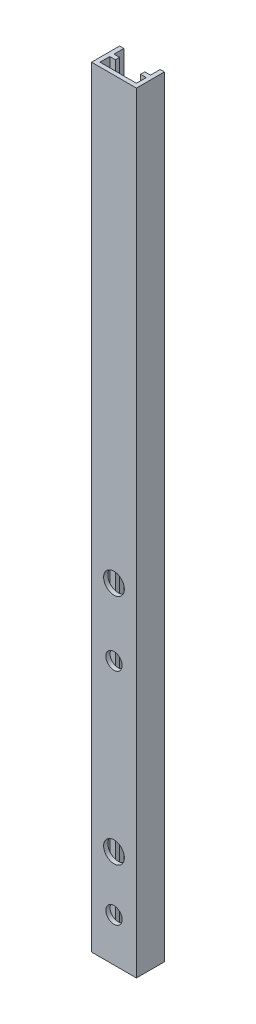
ISO-10303-21;
HEADER;
FILE_DESCRIPTION(('STEP AP214'),'2;1');
FILE_NAME('part.step','',(''),(''),'','','');
FILE_SCHEMA(('AUTOMOTIVE_DESIGN { 1 0 10303 214 1 1 1 1 }'));
ENDSEC;
DATA;
#1=APPLICATION_CONTEXT('core data for automotive mechanical design processes');
#2=APPLICATION_PROTOCOL_DEFINITION('international standard','automotive_design',2000,#1);
#3=PRODUCT_CONTEXT('',#1,'mechanical');
#4=PRODUCT('Part','Part','',(#3));
#5=PRODUCT_RELATED_PRODUCT_CATEGORY('part','',(#4));
#6=PRODUCT_DEFINITION_FORMATION('','',#4);
#7=PRODUCT_DEFINITION_CONTEXT('part definition',#1,'design');
#8=PRODUCT_DEFINITION('design','',#6,#7);
#9=PRODUCT_DEFINITION_SHAPE('','',#8);
#10=(LENGTH_UNIT() NAMED_UNIT(*) SI_UNIT(.MILLI.,.METRE.));
#11=(NAMED_UNIT(*) PLANE_ANGLE_UNIT() SI_UNIT($,.RADIAN.));
#12=(NAMED_UNIT(*) SI_UNIT($,.STERADIAN.) SOLID_ANGLE_UNIT());
#13=UNCERTAINTY_MEASURE_WITH_UNIT(LENGTH_MEASURE(1.E-05),#10,'distance_accuracy_value','');
#14=(GEOMETRIC_REPRESENTATION_CONTEXT(3) GLOBAL_UNCERTAINTY_ASSIGNED_CONTEXT((#13)) GLOBAL_UNIT_ASSIGNED_CONTEXT((#10,
#11,#12)) REPRESENTATION_CONTEXT('',''));
#15=CARTESIAN_POINT('',(0.,0.,0.));
#16=DIRECTION('',(0.,0.,1.));
#17=DIRECTION('',(1.,0.,0.));
#18=AXIS2_PLACEMENT_3D('',#15,#16,#17);
#19=CARTESIAN_POINT('',(16.,275.,0.));
#20=DIRECTION('',(0.,0.,1.));
#21=DIRECTION('',(1.,0.,0.));
#22=AXIS2_PLACEMENT_3D('',#19,#20,#21);
#23=PLANE('',#22);
#24=DIRECTION('',(-1.,0.,0.));
#25=VECTOR('',#24,1.);
#26=CARTESIAN_POINT('',(16.,0.,0.));
#27=LINE('',#26,#25);
#28=CARTESIAN_POINT('',(16.,0.,0.));
#29=VERTEX_POINT('',#28);
#30=CARTESIAN_POINT('',(14.5,0.,0.));
#31=VERTEX_POINT('',#30);
#32=EDGE_CURVE('E182',#29,#31,#27,.T.);
#33=ORIENTED_EDGE('',*,*,#32,.T.);
#34=DIRECTION('',(0.,1.,0.));
#35=VECTOR('',#34,1.);
#36=CARTESIAN_POINT('',(14.5,0.,0.));
#37=LINE('',#36,#35);
#38=CARTESIAN_POINT('',(14.5,275.,0.));
#39=VERTEX_POINT('',#38);
#40=EDGE_CURVE('E183',#31,#39,#37,.T.);
#41=ORIENTED_EDGE('',*,*,#40,.T.);
#42=DIRECTION('',(-1.,0.,0.));
#43=VECTOR('',#42,1.);
#44=CARTESIAN_POINT('',(16.,275.,0.));
#45=LINE('',#44,#43);
#46=CARTESIAN_POINT('',(16.,275.,0.));
#47=VERTEX_POINT('',#46);
#48=EDGE_CURVE('E267',#47,#39,#45,.T.);
#49=ORIENTED_EDGE('',*,*,#48,.F.);
#50=DIRECTION('',(0.,-1.,0.));
#51=VECTOR('',#50,1.);
#52=CARTESIAN_POINT('',(16.,275.,0.));
#53=LINE('',#52,#51);
#54=EDGE_CURVE('E196',#47,#29,#53,.T.);
#55=ORIENTED_EDGE('',*,*,#54,.T.);
#56=EDGE_LOOP('',(#33,#41,#49,#55));
#57=FACE_BOUND('',#56,.T.);
#58=ADVANCED_FACE('F38',(#57),#23,.F.);
#59=CARTESIAN_POINT('',(1.5,275.,0.));
#60=VERTEX_POINT('',#59);
#61=CARTESIAN_POINT('',(0.,275.,0.));
#62=VERTEX_POINT('',#61);
#63=EDGE_CURVE('E92',#60,#62,#45,.T.);
#64=ORIENTED_EDGE('',*,*,#63,.F.);
#65=DIRECTION('',(0.,1.,0.));
#66=VECTOR('',#65,1.);
#67=CARTESIAN_POINT('',(1.5,0.,0.));
#68=LINE('',#67,#66);
#69=CARTESIAN_POINT('',(1.5,0.,0.));
#70=VERTEX_POINT('',#69);
#71=EDGE_CURVE('E166',#70,#60,#68,.T.);
#72=ORIENTED_EDGE('',*,*,#71,.F.);
#73=CARTESIAN_POINT('',(0.,0.,0.));
#74=VERTEX_POINT('',#73);
#75=EDGE_CURVE('E174',#70,#74,#27,.T.);
#76=ORIENTED_EDGE('',*,*,#75,.T.);
#77=DIRECTION('',(0.,-1.,0.));
#78=VECTOR('',#77,1.);
#79=CARTESIAN_POINT('',(0.,275.,0.));
#80=LINE('',#79,#78);
#81=EDGE_CURVE('E11',#62,#74,#80,.T.);
#82=ORIENTED_EDGE('',*,*,#81,.F.);
#83=EDGE_LOOP('',(#64,#72,#76,#82));
#84=FACE_BOUND('',#83,.T.);
#85=ADVANCED_FACE('F40',(#84),#23,.F.);
#86=CARTESIAN_POINT('',(0.,275.,0.));
#87=DIRECTION('',(1.,0.,0.));
#88=DIRECTION('',(0.,0.,-1.));
#89=AXIS2_PLACEMENT_3D('',#86,#87,#88);
#90=PLANE('',#89);
#91=DIRECTION('',(0.,0.,1.));
#92=VECTOR('',#91,1.);
#93=CARTESIAN_POINT('',(0.,0.,0.));
#94=LINE('',#93,#92);
#95=CARTESIAN_POINT('',(0.,0.,10.));
#96=VERTEX_POINT('',#95);
#97=EDGE_CURVE('E181',#74,#96,#94,.T.);
#98=ORIENTED_EDGE('',*,*,#97,.T.);
#99=DIRECTION('',(0.,-1.,0.));
#100=VECTOR('',#99,1.);
#101=CARTESIAN_POINT('',(0.,275.,10.));
#102=LINE('',#101,#100);
#103=CARTESIAN_POINT('',(0.,275.,10.));
#104=VERTEX_POINT('',#103);
#105=EDGE_CURVE('E47',#104,#96,#102,.T.);
#106=ORIENTED_EDGE('',*,*,#105,.F.);
#107=DIRECTION('',(0.,0.,1.));
#108=VECTOR('',#107,1.);
#109=CARTESIAN_POINT('',(0.,275.,0.));
#110=LINE('',#109,#108);
#111=EDGE_CURVE('E269',#62,#104,#110,.T.);
#112=ORIENTED_EDGE('',*,*,#111,.F.);
#113=ORIENTED_EDGE('',*,*,#81,.T.);
#114=EDGE_LOOP('',(#98,#106,#112,#113));
#115=FACE_BOUND('',#114,.T.);
#116=ADVANCED_FACE('F360',(#115),#90,.F.);
#117=CARTESIAN_POINT('',(0.,275.,10.));
#118=DIRECTION('',(0.,0.,-1.));
#119=DIRECTION('',(-1.,0.,0.));
#120=AXIS2_PLACEMENT_3D('',#117,#118,#119);
#121=PLANE('',#120);
#122=CARTESIAN_POINT('',(8.,15.5,10.));
#123=DIRECTION('',(0.,0.,1.));
#124=DIRECTION('',(1.,0.,0.));
#125=AXIS2_PLACEMENT_3D('',#122,#123,#124);
#126=CIRCLE('',#125,2.9);
#127=CARTESIAN_POINT('',(10.9,15.5,10.));
#128=VERTEX_POINT('',#127);
#129=EDGE_CURVE('E206',#128,#128,#126,.T.);
#130=ORIENTED_EDGE('',*,*,#129,.F.);
#131=EDGE_LOOP('',(#130));
#132=FACE_BOUND('',#131,.T.);
#133=CARTESIAN_POINT('',(8.,35.,10.));
#134=DIRECTION('',(0.,0.,1.));
#135=DIRECTION('',(1.,0.,0.));
#136=AXIS2_PLACEMENT_3D('',#133,#134,#135);
#137=CIRCLE('',#136,3.7);
#138=CARTESIAN_POINT('',(11.7,35.,10.));
#139=VERTEX_POINT('',#138);
#140=EDGE_CURVE('E349',#139,#139,#137,.T.);
#141=ORIENTED_EDGE('',*,*,#140,.F.);
#142=EDGE_LOOP('',(#141));
#143=FACE_BOUND('',#142,.T.);
#144=CARTESIAN_POINT('',(8.,94.,10.));
#145=DIRECTION('',(0.,0.,1.));
#146=DIRECTION('',(1.,0.,0.));
#147=AXIS2_PLACEMENT_3D('',#144,#145,#146);
#148=CIRCLE('',#147,2.9);
#149=CARTESIAN_POINT('',(10.9,94.,10.));
#150=VERTEX_POINT('',#149);
#151=EDGE_CURVE('E346',#150,#150,#148,.T.);
#152=ORIENTED_EDGE('',*,*,#151,.F.);
#153=EDGE_LOOP('',(#152));
#154=FACE_BOUND('',#153,.T.);
#155=CARTESIAN_POINT('',(8.,118.,10.));
#156=DIRECTION('',(0.,0.,1.));
#157=DIRECTION('',(1.,0.,0.));
#158=AXIS2_PLACEMENT_3D('',#155,#156,#157);
#159=CIRCLE('',#158,3.7);
#160=CARTESIAN_POINT('',(11.7,118.,10.));
#161=VERTEX_POINT('',#160);
#162=EDGE_CURVE('E343',#161,#161,#159,.T.);
#163=ORIENTED_EDGE('',*,*,#162,.F.);
#164=EDGE_LOOP('',(#163));
#165=FACE_BOUND('',#164,.T.);
#166=DIRECTION('',(1.,0.,0.));
#167=VECTOR('',#166,1.);
#168=CARTESIAN_POINT('',(0.,0.,10.));
#169=LINE('',#168,#167);
#170=CARTESIAN_POINT('',(16.,0.,9.99999999999999));
#171=VERTEX_POINT('',#170);
#172=EDGE_CURVE('E193',#96,#171,#169,.T.);
#173=ORIENTED_EDGE('',*,*,#172,.T.);
#174=DIRECTION('',(0.,-1.,0.));
#175=VECTOR('',#174,1.);
#176=CARTESIAN_POINT('',(16.,275.,9.99999999999999));
#177=LINE('',#176,#175);
#178=CARTESIAN_POINT('',(16.,275.,9.99999999999999));
#179=VERTEX_POINT('',#178);
#180=EDGE_CURVE('E198',#179,#171,#177,.T.);
#181=ORIENTED_EDGE('',*,*,#180,.F.);
#182=DIRECTION('',(1.,0.,0.));
#183=VECTOR('',#182,1.);
#184=CARTESIAN_POINT('',(0.,275.,10.));
#185=LINE('',#184,#183);
#186=EDGE_CURVE('E270',#104,#179,#185,.T.);
#187=ORIENTED_EDGE('',*,*,#186,.F.);
#188=ORIENTED_EDGE('',*,*,#105,.T.);
#189=EDGE_LOOP('',(#173,#181,#187,#188));
#190=FACE_BOUND('',#189,.T.);
#191=ADVANCED_FACE('F277',(#132,#143,#154,#165,#190),#121,.F.);
#192=CARTESIAN_POINT('',(16.,275.,9.99999999999999));
#193=DIRECTION('',(-1.,0.,0.));
#194=DIRECTION('',(0.,0.,1.));
#195=AXIS2_PLACEMENT_3D('',#192,#193,#194);
#196=PLANE('',#195);
#197=DIRECTION('',(0.,0.,-1.));
#198=VECTOR('',#197,1.);
#199=CARTESIAN_POINT('',(16.,0.,9.99999999999999));
#200=LINE('',#199,#198);
#201=EDGE_CURVE('E85',#171,#29,#200,.T.);
#202=ORIENTED_EDGE('',*,*,#201,.T.);
#203=ORIENTED_EDGE('',*,*,#54,.F.);
#204=DIRECTION('',(0.,0.,-1.));
#205=VECTOR('',#204,1.);
#206=CARTESIAN_POINT('',(16.,275.,9.99999999999999));
#207=LINE('',#206,#205);
#208=EDGE_CURVE('E64',#179,#47,#207,.T.);
#209=ORIENTED_EDGE('',*,*,#208,.F.);
#210=ORIENTED_EDGE('',*,*,#180,.T.);
#211=EDGE_LOOP('',(#202,#203,#209,#210));
#212=FACE_BOUND('',#211,.T.);
#213=ADVANCED_FACE('F278',(#212),#196,.F.);
#214=CARTESIAN_POINT('',(0.,275.,0.));
#215=DIRECTION('',(0.,1.,0.));
#216=DIRECTION('',(0.,0.,1.));
#217=AXIS2_PLACEMENT_3D('',#214,#215,#216);
#218=PLANE('',#217);
#219=DIRECTION('',(0.,0.,-1.));
#220=VECTOR('',#219,1.);
#221=CARTESIAN_POINT('',(14.5,275.,3.5));
#222=LINE('',#221,#220);
#223=CARTESIAN_POINT('',(14.5,275.,3.5));
#224=VERTEX_POINT('',#223);
#225=EDGE_CURVE('E170',#224,#39,#222,.T.);
#226=ORIENTED_EDGE('',*,*,#225,.F.);
#227=DIRECTION('',(1.,0.,0.));
#228=VECTOR('',#227,1.);
#229=CARTESIAN_POINT('',(12.5,275.,3.5));
#230=LINE('',#229,#228);
#231=CARTESIAN_POINT('',(12.5,275.,3.5));
#232=VERTEX_POINT('',#231);
#233=EDGE_CURVE('E245',#232,#224,#230,.T.);
#234=ORIENTED_EDGE('',*,*,#233,.F.);
#235=DIRECTION('',(0.,0.,-1.));
#236=VECTOR('',#235,1.);
#237=CARTESIAN_POINT('',(12.5,275.,5.));
#238=LINE('',#237,#236);
#239=CARTESIAN_POINT('',(12.5,275.,5.));
#240=VERTEX_POINT('',#239);
#241=EDGE_CURVE('E242',#240,#232,#238,.T.);
#242=ORIENTED_EDGE('',*,*,#241,.F.);
#243=DIRECTION('',(-1.,0.,0.));
#244=VECTOR('',#243,1.);
#245=CARTESIAN_POINT('',(14.5,275.,5.));
#246=LINE('',#245,#244);
#247=CARTESIAN_POINT('',(14.5,275.,5.));
#248=VERTEX_POINT('',#247);
#249=EDGE_CURVE('E239',#248,#240,#246,.T.);
#250=ORIENTED_EDGE('',*,*,#249,.F.);
#251=DIRECTION('',(0.,0.,-1.));
#252=VECTOR('',#251,1.);
#253=CARTESIAN_POINT('',(14.5,275.,8.5));
#254=LINE('',#253,#252);
#255=CARTESIAN_POINT('',(14.5,275.,8.5));
#256=VERTEX_POINT('',#255);
#257=EDGE_CURVE('E236',#256,#248,#254,.T.);
#258=ORIENTED_EDGE('',*,*,#257,.F.);
#259=DIRECTION('',(1.,0.,0.));
#260=VECTOR('',#259,1.);
#261=CARTESIAN_POINT('',(1.5,275.,8.5));
#262=LINE('',#261,#260);
#263=CARTESIAN_POINT('',(1.5,275.,8.5));
#264=VERTEX_POINT('',#263);
#265=EDGE_CURVE('E233',#264,#256,#262,.T.);
#266=ORIENTED_EDGE('',*,*,#265,.F.);
#267=DIRECTION('',(0.,0.,1.));
#268=VECTOR('',#267,1.);
#269=CARTESIAN_POINT('',(1.5,275.,5.));
#270=LINE('',#269,#268);
#271=CARTESIAN_POINT('',(1.5,275.,5.));
#272=VERTEX_POINT('',#271);
#273=EDGE_CURVE('E230',#272,#264,#270,.T.);
#274=ORIENTED_EDGE('',*,*,#273,.F.);
#275=DIRECTION('',(-1.,0.,0.));
#276=VECTOR('',#275,1.);
#277=CARTESIAN_POINT('',(3.5,275.,5.));
#278=LINE('',#277,#276);
#279=CARTESIAN_POINT('',(3.5,275.,5.));
#280=VERTEX_POINT('',#279);
#281=EDGE_CURVE('E227',#280,#272,#278,.T.);
#282=ORIENTED_EDGE('',*,*,#281,.F.);
#283=DIRECTION('',(0.,0.,1.));
#284=VECTOR('',#283,1.);
#285=CARTESIAN_POINT('',(3.5,275.,3.5));
#286=LINE('',#285,#284);
#287=CARTESIAN_POINT('',(3.5,275.,3.5));
#288=VERTEX_POINT('',#287);
#289=EDGE_CURVE('E220',#288,#280,#286,.T.);
#290=ORIENTED_EDGE('',*,*,#289,.F.);
#291=DIRECTION('',(1.,0.,0.));
#292=VECTOR('',#291,1.);
#293=CARTESIAN_POINT('',(1.5,275.,3.5));
#294=LINE('',#293,#292);
#295=CARTESIAN_POINT('',(1.5,275.,3.5));
#296=VERTEX_POINT('',#295);
#297=EDGE_CURVE('E216',#296,#288,#294,.T.);
#298=ORIENTED_EDGE('',*,*,#297,.F.);
#299=DIRECTION('',(0.,0.,1.));
#300=VECTOR('',#299,1.);
#301=CARTESIAN_POINT('',(1.5,275.,0.));
#302=LINE('',#301,#300);
#303=EDGE_CURVE('E213',#60,#296,#302,.T.);
#304=ORIENTED_EDGE('',*,*,#303,.F.);
#305=ORIENTED_EDGE('',*,*,#63,.T.);
#306=ORIENTED_EDGE('',*,*,#111,.T.);
#307=ORIENTED_EDGE('',*,*,#186,.T.);
#308=ORIENTED_EDGE('',*,*,#208,.T.);
#309=ORIENTED_EDGE('',*,*,#48,.T.);
#310=EDGE_LOOP('',(#226,#234,#242,#250,#258,#266,#274,#282,#290,#298,#304,#305,#306,#307,#308,#309));
#311=FACE_BOUND('',#310,.T.);
#312=ADVANCED_FACE('F274',(#311),#218,.T.);
#313=CARTESIAN_POINT('',(0.,0.,0.));
#314=DIRECTION('',(0.,1.,0.));
#315=DIRECTION('',(0.,0.,1.));
#316=AXIS2_PLACEMENT_3D('',#313,#314,#315);
#317=PLANE('',#316);
#318=DIRECTION('',(1.,0.,0.));
#319=VECTOR('',#318,1.);
#320=CARTESIAN_POINT('',(12.5,0.,3.5));
#321=LINE('',#320,#319);
#322=CARTESIAN_POINT('',(12.5,0.,3.5));
#323=VERTEX_POINT('',#322);
#324=CARTESIAN_POINT('',(14.5,0.,3.5));
#325=VERTEX_POINT('',#324);
#326=EDGE_CURVE('E291',#323,#325,#321,.T.);
#327=ORIENTED_EDGE('',*,*,#326,.T.);
#328=DIRECTION('',(0.,0.,-1.));
#329=VECTOR('',#328,1.);
#330=CARTESIAN_POINT('',(14.5,0.,3.5));
#331=LINE('',#330,#329);
#332=EDGE_CURVE('E176',#325,#31,#331,.T.);
#333=ORIENTED_EDGE('',*,*,#332,.T.);
#334=ORIENTED_EDGE('',*,*,#32,.F.);
#335=ORIENTED_EDGE('',*,*,#201,.F.);
#336=ORIENTED_EDGE('',*,*,#172,.F.);
#337=ORIENTED_EDGE('',*,*,#97,.F.);
#338=ORIENTED_EDGE('',*,*,#75,.F.);
#339=DIRECTION('',(0.,0.,1.));
#340=VECTOR('',#339,1.);
#341=CARTESIAN_POINT('',(1.5,0.,0.));
#342=LINE('',#341,#340);
#343=CARTESIAN_POINT('',(1.5,0.,3.5));
#344=VERTEX_POINT('',#343);
#345=EDGE_CURVE('E162',#70,#344,#342,.T.);
#346=ORIENTED_EDGE('',*,*,#345,.T.);
#347=DIRECTION('',(1.,0.,0.));
#348=VECTOR('',#347,1.);
#349=CARTESIAN_POINT('',(1.5,0.,3.5));
#350=LINE('',#349,#348);
#351=CARTESIAN_POINT('',(3.5,0.,3.5));
#352=VERTEX_POINT('',#351);
#353=EDGE_CURVE('E55',#344,#352,#350,.T.);
#354=ORIENTED_EDGE('',*,*,#353,.T.);
#355=DIRECTION('',(0.,0.,1.));
#356=VECTOR('',#355,1.);
#357=CARTESIAN_POINT('',(3.5,0.,3.5));
#358=LINE('',#357,#356);
#359=CARTESIAN_POINT('',(3.5,0.,5.));
#360=VERTEX_POINT('',#359);
#361=EDGE_CURVE('E331',#352,#360,#358,.T.);
#362=ORIENTED_EDGE('',*,*,#361,.T.);
#363=DIRECTION('',(-1.,0.,0.));
#364=VECTOR('',#363,1.);
#365=CARTESIAN_POINT('',(3.5,0.,5.));
#366=LINE('',#365,#364);
#367=CARTESIAN_POINT('',(1.5,0.,5.));
#368=VERTEX_POINT('',#367);
#369=EDGE_CURVE('E325',#360,#368,#366,.T.);
#370=ORIENTED_EDGE('',*,*,#369,.T.);
#371=DIRECTION('',(0.,0.,1.));
#372=VECTOR('',#371,1.);
#373=CARTESIAN_POINT('',(1.5,0.,5.));
#374=LINE('',#373,#372);
#375=CARTESIAN_POINT('',(1.5,0.,8.5));
#376=VERTEX_POINT('',#375);
#377=EDGE_CURVE('E320',#368,#376,#374,.T.);
#378=ORIENTED_EDGE('',*,*,#377,.T.);
#379=DIRECTION('',(1.,0.,0.));
#380=VECTOR('',#379,1.);
#381=CARTESIAN_POINT('',(1.5,0.,8.5));
#382=LINE('',#381,#380);
#383=CARTESIAN_POINT('',(14.5,0.,8.5));
#384=VERTEX_POINT('',#383);
#385=EDGE_CURVE('E338',#376,#384,#382,.T.);
#386=ORIENTED_EDGE('',*,*,#385,.T.);
#387=DIRECTION('',(0.,0.,-1.));
#388=VECTOR('',#387,1.);
#389=CARTESIAN_POINT('',(14.5,0.,8.5));
#390=LINE('',#389,#388);
#391=CARTESIAN_POINT('',(14.5,0.,5.));
#392=VERTEX_POINT('',#391);
#393=EDGE_CURVE('E308',#384,#392,#390,.T.);
#394=ORIENTED_EDGE('',*,*,#393,.T.);
#395=DIRECTION('',(-1.,0.,0.));
#396=VECTOR('',#395,1.);
#397=CARTESIAN_POINT('',(14.5,0.,5.));
#398=LINE('',#397,#396);
#399=CARTESIAN_POINT('',(12.5,0.,5.));
#400=VERTEX_POINT('',#399);
#401=EDGE_CURVE('E303',#392,#400,#398,.T.);
#402=ORIENTED_EDGE('',*,*,#401,.T.);
#403=DIRECTION('',(0.,0.,-1.));
#404=VECTOR('',#403,1.);
#405=CARTESIAN_POINT('',(12.5,0.,5.));
#406=LINE('',#405,#404);
#407=EDGE_CURVE('E342',#400,#323,#406,.T.);
#408=ORIENTED_EDGE('',*,*,#407,.T.);
#409=EDGE_LOOP('',(#327,#333,#334,#335,#336,#337,#338,#346,#354,#362,#370,#378,#386,#394,#402,#408));
#410=FACE_BOUND('',#409,.T.);
#411=ADVANCED_FACE('F179',(#410),#317,.F.);
#412=CARTESIAN_POINT('',(14.5,0.,3.5));
#413=DIRECTION('',(1.,0.,0.));
#414=DIRECTION('',(0.,0.,-1.));
#415=AXIS2_PLACEMENT_3D('',#412,#413,#414);
#416=PLANE('',#415);
#417=ORIENTED_EDGE('',*,*,#225,.T.);
#418=ORIENTED_EDGE('',*,*,#40,.F.);
#419=ORIENTED_EDGE('',*,*,#332,.F.);
#420=DIRECTION('',(0.,1.,0.));
#421=VECTOR('',#420,1.);
#422=CARTESIAN_POINT('',(14.5,0.,3.5));
#423=LINE('',#422,#421);
#424=EDGE_CURVE('E187',#325,#224,#423,.T.);
#425=ORIENTED_EDGE('',*,*,#424,.T.);
#426=EDGE_LOOP('',(#417,#418,#419,#425));
#427=FACE_BOUND('',#426,.T.);
#428=ADVANCED_FACE('F285',(#427),#416,.F.);
#429=CARTESIAN_POINT('',(12.5,0.,3.5));
#430=DIRECTION('',(0.,0.,1.));
#431=DIRECTION('',(1.,0.,0.));
#432=AXIS2_PLACEMENT_3D('',#429,#430,#431);
#433=PLANE('',#432);
#434=ORIENTED_EDGE('',*,*,#233,.T.);
#435=ORIENTED_EDGE('',*,*,#424,.F.);
#436=ORIENTED_EDGE('',*,*,#326,.F.);
#437=DIRECTION('',(0.,1.,0.));
#438=VECTOR('',#437,1.);
#439=CARTESIAN_POINT('',(12.5,0.,3.5));
#440=LINE('',#439,#438);
#441=EDGE_CURVE('E250',#323,#232,#440,.T.);
#442=ORIENTED_EDGE('',*,*,#441,.T.);
#443=EDGE_LOOP('',(#434,#435,#436,#442));
#444=FACE_BOUND('',#443,.T.);
#445=ADVANCED_FACE('F290',(#444),#433,.F.);
#446=CARTESIAN_POINT('',(12.5,0.,5.));
#447=DIRECTION('',(1.,0.,0.));
#448=DIRECTION('',(0.,0.,-1.));
#449=AXIS2_PLACEMENT_3D('',#446,#447,#448);
#450=PLANE('',#449);
#451=ORIENTED_EDGE('',*,*,#241,.T.);
#452=ORIENTED_EDGE('',*,*,#441,.F.);
#453=ORIENTED_EDGE('',*,*,#407,.F.);
#454=DIRECTION('',(0.,1.,0.));
#455=VECTOR('',#454,1.);
#456=CARTESIAN_POINT('',(12.5,0.,5.));
#457=LINE('',#456,#455);
#458=EDGE_CURVE('E252',#400,#240,#457,.T.);
#459=ORIENTED_EDGE('',*,*,#458,.T.);
#460=EDGE_LOOP('',(#451,#452,#453,#459));
#461=FACE_BOUND('',#460,.T.);
#462=ADVANCED_FACE('F295',(#461),#450,.F.);
#463=CARTESIAN_POINT('',(14.5,0.,5.));
#464=DIRECTION('',(0.,0.,-1.));
#465=DIRECTION('',(-1.,0.,0.));
#466=AXIS2_PLACEMENT_3D('',#463,#464,#465);
#467=PLANE('',#466);
#468=ORIENTED_EDGE('',*,*,#249,.T.);
#469=ORIENTED_EDGE('',*,*,#458,.F.);
#470=ORIENTED_EDGE('',*,*,#401,.F.);
#471=DIRECTION('',(0.,1.,0.));
#472=VECTOR('',#471,1.);
#473=CARTESIAN_POINT('',(14.5,0.,5.));
#474=LINE('',#473,#472);
#475=EDGE_CURVE('E254',#392,#248,#474,.T.);
#476=ORIENTED_EDGE('',*,*,#475,.T.);
#477=EDGE_LOOP('',(#468,#469,#470,#476));
#478=FACE_BOUND('',#477,.T.);
#479=ADVANCED_FACE('F300',(#478),#467,.F.);
#480=CARTESIAN_POINT('',(14.5,0.,8.5));
#481=DIRECTION('',(1.,0.,0.));
#482=DIRECTION('',(0.,0.,-1.));
#483=AXIS2_PLACEMENT_3D('',#480,#481,#482);
#484=PLANE('',#483);
#485=ORIENTED_EDGE('',*,*,#257,.T.);
#486=ORIENTED_EDGE('',*,*,#475,.F.);
#487=ORIENTED_EDGE('',*,*,#393,.F.);
#488=DIRECTION('',(0.,1.,0.));
#489=VECTOR('',#488,1.);
#490=CARTESIAN_POINT('',(14.5,0.,8.5));
#491=LINE('',#490,#489);
#492=EDGE_CURVE('E256',#384,#256,#491,.T.);
#493=ORIENTED_EDGE('',*,*,#492,.T.);
#494=EDGE_LOOP('',(#485,#486,#487,#493));
#495=FACE_BOUND('',#494,.T.);
#496=ADVANCED_FACE('F307',(#495),#484,.F.);
#497=CARTESIAN_POINT('',(1.5,0.,8.5));
#498=DIRECTION('',(0.,0.,1.));
#499=DIRECTION('',(1.,0.,0.));
#500=AXIS2_PLACEMENT_3D('',#497,#498,#499);
#501=PLANE('',#500);
#502=CARTESIAN_POINT('',(8.,15.5,8.5));
#503=DIRECTION('',(0.,0.,1.));
#504=DIRECTION('',(1.,0.,0.));
#505=AXIS2_PLACEMENT_3D('',#502,#503,#504);
#506=CIRCLE('',#505,2.9);
#507=CARTESIAN_POINT('',(10.9,15.5,8.5));
#508=VERTEX_POINT('',#507);
#509=EDGE_CURVE('E42',#508,#508,#506,.T.);
#510=ORIENTED_EDGE('',*,*,#509,.T.);
#511=EDGE_LOOP('',(#510));
#512=FACE_BOUND('',#511,.T.);
#513=CARTESIAN_POINT('',(8.,35.,8.5));
#514=DIRECTION('',(0.,0.,1.));
#515=DIRECTION('',(1.,0.,0.));
#516=AXIS2_PLACEMENT_3D('',#513,#514,#515);
#517=CIRCLE('',#516,3.7);
#518=CARTESIAN_POINT('',(11.7,35.,8.5));
#519=VERTEX_POINT('',#518);
#520=EDGE_CURVE('E208',#519,#519,#517,.T.);
#521=ORIENTED_EDGE('',*,*,#520,.T.);
#522=EDGE_LOOP('',(#521));
#523=FACE_BOUND('',#522,.T.);
#524=CARTESIAN_POINT('',(8.,94.,8.5));
#525=DIRECTION('',(0.,0.,1.));
#526=DIRECTION('',(1.,0.,0.));
#527=AXIS2_PLACEMENT_3D('',#524,#525,#526);
#528=CIRCLE('',#527,2.9);
#529=CARTESIAN_POINT('',(10.9,94.,8.5));
#530=VERTEX_POINT('',#529);
#531=EDGE_CURVE('E205',#530,#530,#528,.T.);
#532=ORIENTED_EDGE('',*,*,#531,.T.);
#533=EDGE_LOOP('',(#532));
#534=FACE_BOUND('',#533,.T.);
#535=CARTESIAN_POINT('',(8.,118.,8.5));
#536=DIRECTION('',(0.,0.,1.));
#537=DIRECTION('',(1.,0.,0.));
#538=AXIS2_PLACEMENT_3D('',#535,#536,#537);
#539=CIRCLE('',#538,3.7);
#540=CARTESIAN_POINT('',(11.7,118.,8.5));
#541=VERTEX_POINT('',#540);
#542=EDGE_CURVE('E202',#541,#541,#539,.T.);
#543=ORIENTED_EDGE('',*,*,#542,.T.);
#544=EDGE_LOOP('',(#543));
#545=FACE_BOUND('',#544,.T.);
#546=ORIENTED_EDGE('',*,*,#265,.T.);
#547=ORIENTED_EDGE('',*,*,#492,.F.);
#548=ORIENTED_EDGE('',*,*,#385,.F.);
#549=DIRECTION('',(0.,1.,0.));
#550=VECTOR('',#549,1.);
#551=CARTESIAN_POINT('',(1.5,0.,8.5));
#552=LINE('',#551,#550);
#553=EDGE_CURVE('E258',#376,#264,#552,.T.);
#554=ORIENTED_EDGE('',*,*,#553,.T.);
#555=EDGE_LOOP('',(#546,#547,#548,#554));
#556=FACE_BOUND('',#555,.T.);
#557=ADVANCED_FACE('F312',(#512,#523,#534,#545,#556),#501,.F.);
#558=CARTESIAN_POINT('',(1.5,0.,5.));
#559=DIRECTION('',(-1.,0.,0.));
#560=DIRECTION('',(0.,0.,1.));
#561=AXIS2_PLACEMENT_3D('',#558,#559,#560);
#562=PLANE('',#561);
#563=ORIENTED_EDGE('',*,*,#273,.T.);
#564=ORIENTED_EDGE('',*,*,#553,.F.);
#565=ORIENTED_EDGE('',*,*,#377,.F.);
#566=DIRECTION('',(0.,1.,0.));
#567=VECTOR('',#566,1.);
#568=CARTESIAN_POINT('',(1.5,0.,5.));
#569=LINE('',#568,#567);
#570=EDGE_CURVE('E260',#368,#272,#569,.T.);
#571=ORIENTED_EDGE('',*,*,#570,.T.);
#572=EDGE_LOOP('',(#563,#564,#565,#571));
#573=FACE_BOUND('',#572,.T.);
#574=ADVANCED_FACE('F317',(#573),#562,.F.);
#575=CARTESIAN_POINT('',(3.5,0.,5.));
#576=DIRECTION('',(0.,0.,-1.));
#577=DIRECTION('',(-1.,0.,0.));
#578=AXIS2_PLACEMENT_3D('',#575,#576,#577);
#579=PLANE('',#578);
#580=ORIENTED_EDGE('',*,*,#281,.T.);
#581=ORIENTED_EDGE('',*,*,#570,.F.);
#582=ORIENTED_EDGE('',*,*,#369,.F.);
#583=DIRECTION('',(0.,1.,0.));
#584=VECTOR('',#583,1.);
#585=CARTESIAN_POINT('',(3.5,0.,5.));
#586=LINE('',#585,#584);
#587=EDGE_CURVE('E262',#360,#280,#586,.T.);
#588=ORIENTED_EDGE('',*,*,#587,.T.);
#589=EDGE_LOOP('',(#580,#581,#582,#588));
#590=FACE_BOUND('',#589,.T.);
#591=ADVANCED_FACE('F324',(#590),#579,.F.);
#592=CARTESIAN_POINT('',(3.5,0.,3.5));
#593=DIRECTION('',(-1.,0.,0.));
#594=DIRECTION('',(0.,0.,1.));
#595=AXIS2_PLACEMENT_3D('',#592,#593,#594);
#596=PLANE('',#595);
#597=ORIENTED_EDGE('',*,*,#289,.T.);
#598=ORIENTED_EDGE('',*,*,#587,.F.);
#599=ORIENTED_EDGE('',*,*,#361,.F.);
#600=DIRECTION('',(0.,1.,0.));
#601=VECTOR('',#600,1.);
#602=CARTESIAN_POINT('',(3.5,0.,3.5));
#603=LINE('',#602,#601);
#604=EDGE_CURVE('E264',#352,#288,#603,.T.);
#605=ORIENTED_EDGE('',*,*,#604,.T.);
#606=EDGE_LOOP('',(#597,#598,#599,#605));
#607=FACE_BOUND('',#606,.T.);
#608=ADVANCED_FACE('F329',(#607),#596,.F.);
#609=CARTESIAN_POINT('',(1.5,0.,3.5));
#610=DIRECTION('',(0.,0.,1.));
#611=DIRECTION('',(1.,0.,0.));
#612=AXIS2_PLACEMENT_3D('',#609,#610,#611);
#613=PLANE('',#612);
#614=ORIENTED_EDGE('',*,*,#297,.T.);
#615=ORIENTED_EDGE('',*,*,#604,.F.);
#616=ORIENTED_EDGE('',*,*,#353,.F.);
#617=DIRECTION('',(0.,1.,0.));
#618=VECTOR('',#617,1.);
#619=CARTESIAN_POINT('',(1.5,0.,3.5));
#620=LINE('',#619,#618);
#621=EDGE_CURVE('E167',#344,#296,#620,.T.);
#622=ORIENTED_EDGE('',*,*,#621,.T.);
#623=EDGE_LOOP('',(#614,#615,#616,#622));
#624=FACE_BOUND('',#623,.T.);
#625=ADVANCED_FACE('F330',(#624),#613,.F.);
#626=CARTESIAN_POINT('',(1.5,0.,0.));
#627=DIRECTION('',(-1.,0.,0.));
#628=DIRECTION('',(0.,0.,1.));
#629=AXIS2_PLACEMENT_3D('',#626,#627,#628);
#630=PLANE('',#629);
#631=ORIENTED_EDGE('',*,*,#303,.T.);
#632=ORIENTED_EDGE('',*,*,#621,.F.);
#633=ORIENTED_EDGE('',*,*,#345,.F.);
#634=ORIENTED_EDGE('',*,*,#71,.T.);
#635=EDGE_LOOP('',(#631,#632,#633,#634));
#636=FACE_BOUND('',#635,.T.);
#637=ADVANCED_FACE('F165',(#636),#630,.F.);
#638=CARTESIAN_POINT('',(8.,118.,0.));
#639=DIRECTION('',(0.,0.,1.));
#640=DIRECTION('',(1.,0.,0.));
#641=AXIS2_PLACEMENT_3D('',#638,#639,#640);
#642=CYLINDRICAL_SURFACE('',#641,3.7);
#643=ORIENTED_EDGE('',*,*,#162,.T.);
#644=EDGE_LOOP('',(#643));
#645=FACE_BOUND('',#644,.T.);
#646=ORIENTED_EDGE('',*,*,#542,.F.);
#647=EDGE_LOOP('',(#646));
#648=FACE_BOUND('',#647,.T.);
#649=ADVANCED_FACE('F368',(#645,#648),#642,.F.);
#650=CARTESIAN_POINT('',(8.,94.,0.));
#651=DIRECTION('',(0.,0.,1.));
#652=DIRECTION('',(1.,0.,0.));
#653=AXIS2_PLACEMENT_3D('',#650,#651,#652);
#654=CYLINDRICAL_SURFACE('',#653,2.9);
#655=ORIENTED_EDGE('',*,*,#151,.T.);
#656=EDGE_LOOP('',(#655));
#657=FACE_BOUND('',#656,.T.);
#658=ORIENTED_EDGE('',*,*,#531,.F.);
#659=EDGE_LOOP('',(#658));
#660=FACE_BOUND('',#659,.T.);
#661=ADVANCED_FACE('F371',(#657,#660),#654,.F.);
#662=CARTESIAN_POINT('',(8.,35.,0.));
#663=DIRECTION('',(0.,0.,1.));
#664=DIRECTION('',(1.,0.,0.));
#665=AXIS2_PLACEMENT_3D('',#662,#663,#664);
#666=CYLINDRICAL_SURFACE('',#665,3.7);
#667=ORIENTED_EDGE('',*,*,#140,.T.);
#668=EDGE_LOOP('',(#667));
#669=FACE_BOUND('',#668,.T.);
#670=ORIENTED_EDGE('',*,*,#520,.F.);
#671=EDGE_LOOP('',(#670));
#672=FACE_BOUND('',#671,.T.);
#673=ADVANCED_FACE('F434',(#669,#672),#666,.F.);
#674=CARTESIAN_POINT('',(8.,15.5,0.));
#675=DIRECTION('',(0.,0.,1.));
#676=DIRECTION('',(1.,0.,0.));
#677=AXIS2_PLACEMENT_3D('',#674,#675,#676);
#678=CYLINDRICAL_SURFACE('',#677,2.9);
#679=ORIENTED_EDGE('',*,*,#129,.T.);
#680=EDGE_LOOP('',(#679));
#681=FACE_BOUND('',#680,.T.);
#682=ORIENTED_EDGE('',*,*,#509,.F.);
#683=EDGE_LOOP('',(#682));
#684=FACE_BOUND('',#683,.T.);
#685=ADVANCED_FACE('F355',(#681,#684),#678,.F.);
#686=CLOSED_SHELL('',(#58,#85,#116,#191,#213,#312,#411,#428,#445,#462,#479,#496,#557,#574,#591,
#608,#625,#637,#649,#661,#673,#685));
#687=MANIFOLD_SOLID_BREP('B2',#686);
#688=ADVANCED_BREP_SHAPE_REPRESENTATION('',(#18,#687),#14);
#689=SHAPE_DEFINITION_REPRESENTATION(#9,#688);
ENDSEC;
END-ISO-10303-21;
